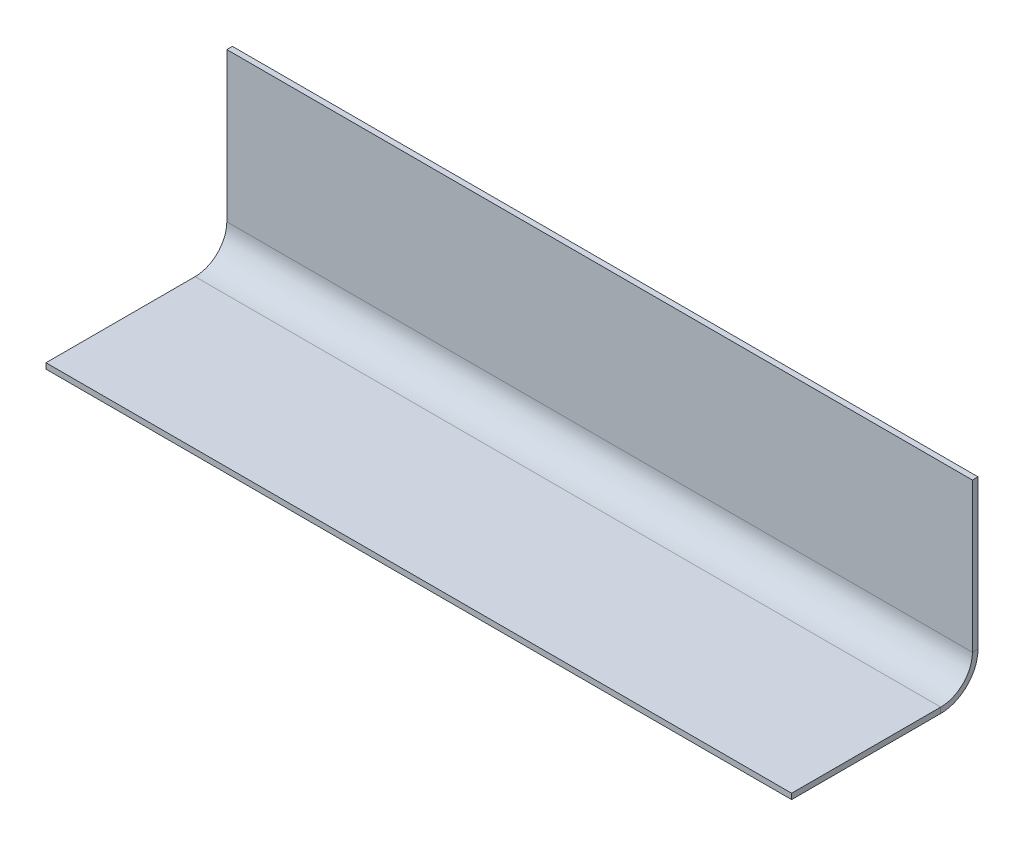
ISO-10303-21;
HEADER;
FILE_DESCRIPTION(('STEP AP214'),'2;1');
FILE_NAME('part.step','',(''),(''),'','','');
FILE_SCHEMA(('AUTOMOTIVE_DESIGN { 1 0 10303 214 1 1 1 1 }'));
ENDSEC;
DATA;
#1=APPLICATION_CONTEXT('core data for automotive mechanical design processes');
#2=APPLICATION_PROTOCOL_DEFINITION('international standard','automotive_design',2000,#1);
#3=PRODUCT_CONTEXT('',#1,'mechanical');
#4=PRODUCT('Part','Part','',(#3));
#5=PRODUCT_RELATED_PRODUCT_CATEGORY('part','',(#4));
#6=PRODUCT_DEFINITION_FORMATION('','',#4);
#7=PRODUCT_DEFINITION_CONTEXT('part definition',#1,'design');
#8=PRODUCT_DEFINITION('design','',#6,#7);
#9=PRODUCT_DEFINITION_SHAPE('','',#8);
#10=(LENGTH_UNIT() NAMED_UNIT(*) SI_UNIT(.MILLI.,.METRE.));
#11=(NAMED_UNIT(*) PLANE_ANGLE_UNIT() SI_UNIT($,.RADIAN.));
#12=(NAMED_UNIT(*) SI_UNIT($,.STERADIAN.) SOLID_ANGLE_UNIT());
#13=UNCERTAINTY_MEASURE_WITH_UNIT(LENGTH_MEASURE(1.E-05),#10,'distance_accuracy_value','');
#14=(GEOMETRIC_REPRESENTATION_CONTEXT(3) GLOBAL_UNCERTAINTY_ASSIGNED_CONTEXT((#13)) GLOBAL_UNIT_ASSIGNED_CONTEXT((#10,
#11,#12)) REPRESENTATION_CONTEXT('',''));
#15=CARTESIAN_POINT('',(0.,0.,0.));
#16=DIRECTION('',(0.,0.,1.));
#17=DIRECTION('',(1.,0.,0.));
#18=AXIS2_PLACEMENT_3D('',#15,#16,#17);
#19=CARTESIAN_POINT('',(200.,50.,-3.));
#20=DIRECTION('',(1.,0.,0.));
#21=DIRECTION('',(0.,0.,-1.));
#22=AXIS2_PLACEMENT_3D('',#19,#20,#21);
#23=PLANE('',#22);
#24=DIRECTION('',(0.,1.,0.));
#25=VECTOR('',#24,1.);
#26=CARTESIAN_POINT('',(200.,50.,0.));
#27=LINE('',#26,#25);
#28=CARTESIAN_POINT('',(200.,-30.0000000000001,0.));
#29=VERTEX_POINT('',#28);
#30=CARTESIAN_POINT('',(200.,50.,0.));
#31=VERTEX_POINT('',#30);
#32=EDGE_CURVE('E107',#29,#31,#27,.T.);
#33=ORIENTED_EDGE('',*,*,#32,.F.);
#34=DIRECTION('',(0.,0.,-1.));
#35=VECTOR('',#34,1.);
#36=CARTESIAN_POINT('',(200.,-30.0000000000001,0.));
#37=LINE('',#36,#35);
#38=CARTESIAN_POINT('',(200.,-30.0000000000001,-3.));
#39=VERTEX_POINT('',#38);
#40=EDGE_CURVE('E116',#29,#39,#37,.T.);
#41=ORIENTED_EDGE('',*,*,#40,.T.);
#42=DIRECTION('',(0.,1.,0.));
#43=VECTOR('',#42,1.);
#44=CARTESIAN_POINT('',(200.,50.,-3.));
#45=LINE('',#44,#43);
#46=CARTESIAN_POINT('',(200.,50.,-3.));
#47=VERTEX_POINT('',#46);
#48=EDGE_CURVE('E104',#39,#47,#45,.T.);
#49=ORIENTED_EDGE('',*,*,#48,.T.);
#50=DIRECTION('',(0.,0.,1.));
#51=VECTOR('',#50,1.);
#52=CARTESIAN_POINT('',(200.,50.,-3.));
#53=LINE('',#52,#51);
#54=EDGE_CURVE('E62',#47,#31,#53,.T.);
#55=ORIENTED_EDGE('',*,*,#54,.T.);
#56=EDGE_LOOP('',(#33,#41,#49,#55));
#57=FACE_BOUND('',#56,.T.);
#58=ADVANCED_FACE('F59',(#57),#23,.T.);
#59=CARTESIAN_POINT('',(0.,0.,-3.));
#60=DIRECTION('',(0.,0.,1.));
#61=DIRECTION('',(1.,0.,0.));
#62=AXIS2_PLACEMENT_3D('',#59,#60,#61);
#63=PLANE('',#62);
#64=DIRECTION('',(1.,0.,0.));
#65=VECTOR('',#64,1.);
#66=CARTESIAN_POINT('',(200.,-30.0000000000001,-3.));
#67=LINE('',#66,#65);
#68=CARTESIAN_POINT('',(-200.,-30.,-3.));
#69=VERTEX_POINT('',#68);
#70=EDGE_CURVE('E132',#39,#69,#67,.F.);
#71=ORIENTED_EDGE('',*,*,#70,.T.);
#72=DIRECTION('',(0.,-1.,0.));
#73=VECTOR('',#72,1.);
#74=CARTESIAN_POINT('',(-200.,50.,-3.));
#75=LINE('',#74,#73);
#76=CARTESIAN_POINT('',(-200.,50.,-3.));
#77=VERTEX_POINT('',#76);
#78=EDGE_CURVE('E112',#77,#69,#75,.T.);
#79=ORIENTED_EDGE('',*,*,#78,.F.);
#80=DIRECTION('',(-1.,0.,0.));
#81=VECTOR('',#80,1.);
#82=CARTESIAN_POINT('',(-200.,50.,-3.));
#83=LINE('',#82,#81);
#84=EDGE_CURVE('E97',#47,#77,#83,.T.);
#85=ORIENTED_EDGE('',*,*,#84,.F.);
#86=ORIENTED_EDGE('',*,*,#48,.F.);
#87=EDGE_LOOP('',(#71,#79,#85,#86));
#88=FACE_BOUND('',#87,.T.);
#89=ADVANCED_FACE('F223',(#88),#63,.F.);
#90=CARTESIAN_POINT('',(0.,0.,0.));
#91=DIRECTION('',(0.,0.,1.));
#92=DIRECTION('',(1.,0.,0.));
#93=AXIS2_PLACEMENT_3D('',#90,#91,#92);
#94=PLANE('',#93);
#95=DIRECTION('',(0.,-1.,0.));
#96=VECTOR('',#95,1.);
#97=CARTESIAN_POINT('',(-200.,50.,0.));
#98=LINE('',#97,#96);
#99=CARTESIAN_POINT('',(-200.,50.,0.));
#100=VERTEX_POINT('',#99);
#101=CARTESIAN_POINT('',(-200.,-30.0000000000001,0.));
#102=VERTEX_POINT('',#101);
#103=EDGE_CURVE('E99',#100,#102,#98,.T.);
#104=ORIENTED_EDGE('',*,*,#103,.T.);
#105=DIRECTION('',(1.,0.,0.));
#106=VECTOR('',#105,1.);
#107=CARTESIAN_POINT('',(200.,-30.0000000000001,0.));
#108=LINE('',#107,#106);
#109=EDGE_CURVE('E73',#29,#102,#108,.F.);
#110=ORIENTED_EDGE('',*,*,#109,.F.);
#111=ORIENTED_EDGE('',*,*,#32,.T.);
#112=DIRECTION('',(-1.,0.,0.));
#113=VECTOR('',#112,1.);
#114=CARTESIAN_POINT('',(-200.,50.,0.));
#115=LINE('',#114,#113);
#116=EDGE_CURVE('E95',#31,#100,#115,.T.);
#117=ORIENTED_EDGE('',*,*,#116,.T.);
#118=EDGE_LOOP('',(#104,#110,#111,#117));
#119=FACE_BOUND('',#118,.T.);
#120=ADVANCED_FACE('F106',(#119),#94,.T.);
#121=CARTESIAN_POINT('',(-200.,50.,-3.));
#122=DIRECTION('',(-1.,0.,0.));
#123=DIRECTION('',(0.,0.,1.));
#124=AXIS2_PLACEMENT_3D('',#121,#122,#123);
#125=PLANE('',#124);
#126=DIRECTION('',(0.,0.,-1.));
#127=VECTOR('',#126,1.);
#128=CARTESIAN_POINT('',(-200.,-30.0000000000001,0.));
#129=LINE('',#128,#127);
#130=EDGE_CURVE('E103',#102,#69,#129,.T.);
#131=ORIENTED_EDGE('',*,*,#130,.F.);
#132=ORIENTED_EDGE('',*,*,#103,.F.);
#133=DIRECTION('',(0.,0.,1.));
#134=VECTOR('',#133,1.);
#135=CARTESIAN_POINT('',(-200.,50.,-3.));
#136=LINE('',#135,#134);
#137=EDGE_CURVE('E13',#77,#100,#136,.T.);
#138=ORIENTED_EDGE('',*,*,#137,.F.);
#139=ORIENTED_EDGE('',*,*,#78,.T.);
#140=EDGE_LOOP('',(#131,#132,#138,#139));
#141=FACE_BOUND('',#140,.T.);
#142=ADVANCED_FACE('F100',(#141),#125,.T.);
#143=CARTESIAN_POINT('',(-200.,50.,-3.));
#144=DIRECTION('',(0.,1.,0.));
#145=DIRECTION('',(0.,0.,1.));
#146=AXIS2_PLACEMENT_3D('',#143,#144,#145);
#147=PLANE('',#146);
#148=ORIENTED_EDGE('',*,*,#116,.F.);
#149=ORIENTED_EDGE('',*,*,#54,.F.);
#150=ORIENTED_EDGE('',*,*,#84,.T.);
#151=ORIENTED_EDGE('',*,*,#137,.T.);
#152=EDGE_LOOP('',(#148,#149,#150,#151));
#153=FACE_BOUND('',#152,.T.);
#154=ADVANCED_FACE('F92',(#153),#147,.T.);
#155=CARTESIAN_POINT('',(-200.,-30.0000000000001,17.));
#156=DIRECTION('',(-1.,0.,0.));
#157=DIRECTION('',(0.,0.,1.));
#158=AXIS2_PLACEMENT_3D('',#155,#156,#157);
#159=PLANE('',#158);
#160=DIRECTION('',(0.,-1.,0.));
#161=VECTOR('',#160,1.);
#162=CARTESIAN_POINT('',(-200.,-50.0000000000001,16.9999999999999));
#163=LINE('',#162,#161);
#164=CARTESIAN_POINT('',(-200.,-47.0000000000001,16.9999999999999));
#165=VERTEX_POINT('',#164);
#166=CARTESIAN_POINT('',(-200.,-50.0000000000001,16.9999999999999));
#167=VERTEX_POINT('',#166);
#168=EDGE_CURVE('E137',#165,#167,#163,.T.);
#169=ORIENTED_EDGE('',*,*,#168,.F.);
#170=CARTESIAN_POINT('',(-200.,-30.0000000000001,17.));
#171=DIRECTION('',(1.,0.,0.));
#172=DIRECTION('',(0.,0.,-1.));
#173=AXIS2_PLACEMENT_3D('',#170,#171,#172);
#174=CIRCLE('',#173,17.);
#175=EDGE_CURVE('E126',#102,#165,#174,.F.);
#176=ORIENTED_EDGE('',*,*,#175,.F.);
#177=ORIENTED_EDGE('',*,*,#130,.T.);
#178=CARTESIAN_POINT('',(-200.,-30.0000000000001,17.));
#179=DIRECTION('',(1.,0.,0.));
#180=DIRECTION('',(0.,0.,-1.));
#181=AXIS2_PLACEMENT_3D('',#178,#179,#180);
#182=CIRCLE('',#181,20.);
#183=EDGE_CURVE('E119',#69,#167,#182,.F.);
#184=ORIENTED_EDGE('',*,*,#183,.T.);
#185=EDGE_LOOP('',(#169,#176,#177,#184));
#186=FACE_BOUND('',#185,.T.);
#187=ADVANCED_FACE('F214',(#186),#159,.T.);
#188=CARTESIAN_POINT('',(200.,-30.0000000000001,17.));
#189=DIRECTION('',(-1.,0.,0.));
#190=DIRECTION('',(0.,0.,1.));
#191=AXIS2_PLACEMENT_3D('',#188,#189,#190);
#192=PLANE('',#191);
#193=CARTESIAN_POINT('',(200.,-30.0000000000001,17.));
#194=DIRECTION('',(1.,0.,0.));
#195=DIRECTION('',(0.,0.,-1.));
#196=AXIS2_PLACEMENT_3D('',#193,#194,#195);
#197=CIRCLE('',#196,17.);
#198=CARTESIAN_POINT('',(200.,-47.0000000000001,16.9999999999999));
#199=VERTEX_POINT('',#198);
#200=EDGE_CURVE('E121',#199,#29,#197,.T.);
#201=ORIENTED_EDGE('',*,*,#200,.F.);
#202=DIRECTION('',(0.,-1.,0.));
#203=VECTOR('',#202,1.);
#204=CARTESIAN_POINT('',(200.,-47.0000000000001,16.9999999999999));
#205=LINE('',#204,#203);
#206=CARTESIAN_POINT('',(200.,-50.0000000000001,16.9999999999999));
#207=VERTEX_POINT('',#206);
#208=EDGE_CURVE('E143',#199,#207,#205,.T.);
#209=ORIENTED_EDGE('',*,*,#208,.T.);
#210=CARTESIAN_POINT('',(200.,-30.0000000000001,17.));
#211=DIRECTION('',(1.,0.,0.));
#212=DIRECTION('',(0.,0.,-1.));
#213=AXIS2_PLACEMENT_3D('',#210,#211,#212);
#214=CIRCLE('',#213,20.);
#215=EDGE_CURVE('E129',#207,#39,#214,.T.);
#216=ORIENTED_EDGE('',*,*,#215,.T.);
#217=ORIENTED_EDGE('',*,*,#40,.F.);
#218=EDGE_LOOP('',(#201,#209,#216,#217));
#219=FACE_BOUND('',#218,.T.);
#220=ADVANCED_FACE('F198',(#219),#192,.F.);
#221=CARTESIAN_POINT('',(200.,-30.0000000000001,17.));
#222=DIRECTION('',(1.,0.,0.));
#223=DIRECTION('',(0.,-1.,0.));
#224=AXIS2_PLACEMENT_3D('',#221,#222,#223);
#225=CYLINDRICAL_SURFACE('',#224,20.);
#226=ORIENTED_EDGE('',*,*,#70,.F.);
#227=ORIENTED_EDGE('',*,*,#215,.F.);
#228=DIRECTION('',(1.,0.,0.));
#229=VECTOR('',#228,1.);
#230=CARTESIAN_POINT('',(0.,-50.0000000000001,16.9999999999999));
#231=LINE('',#230,#229);
#232=EDGE_CURVE('E146',#167,#207,#231,.T.);
#233=ORIENTED_EDGE('',*,*,#232,.F.);
#234=ORIENTED_EDGE('',*,*,#183,.F.);
#235=EDGE_LOOP('',(#226,#227,#233,#234));
#236=FACE_BOUND('',#235,.T.);
#237=ADVANCED_FACE('F210',(#236),#225,.T.);
#238=CARTESIAN_POINT('',(200.,-30.0000000000001,17.));
#239=DIRECTION('',(1.,0.,0.));
#240=DIRECTION('',(0.,-1.,0.));
#241=AXIS2_PLACEMENT_3D('',#238,#239,#240);
#242=CYLINDRICAL_SURFACE('',#241,17.);
#243=ORIENTED_EDGE('',*,*,#109,.T.);
#244=ORIENTED_EDGE('',*,*,#175,.T.);
#245=DIRECTION('',(-1.,0.,0.));
#246=VECTOR('',#245,1.);
#247=CARTESIAN_POINT('',(-200.,-47.0000000000001,16.9999999999999));
#248=LINE('',#247,#246);
#249=EDGE_CURVE('E140',#165,#199,#248,.F.);
#250=ORIENTED_EDGE('',*,*,#249,.T.);
#251=ORIENTED_EDGE('',*,*,#200,.T.);
#252=EDGE_LOOP('',(#243,#244,#250,#251));
#253=FACE_BOUND('',#252,.T.);
#254=ADVANCED_FACE('F226',(#253),#242,.F.);
#255=CARTESIAN_POINT('',(200.,-50.,0.));
#256=DIRECTION('',(1.,0.,0.));
#257=DIRECTION('',(0.,0.,-1.));
#258=AXIS2_PLACEMENT_3D('',#255,#256,#257);
#259=PLANE('',#258);
#260=DIRECTION('',(0.,0.,-1.));
#261=VECTOR('',#260,1.);
#262=CARTESIAN_POINT('',(200.,-50.,0.));
#263=LINE('',#262,#261);
#264=CARTESIAN_POINT('',(200.,-50.0000000000003,96.9999999999996));
#265=VERTEX_POINT('',#264);
#266=EDGE_CURVE('E164',#265,#207,#263,.T.);
#267=ORIENTED_EDGE('',*,*,#266,.T.);
#268=ORIENTED_EDGE('',*,*,#208,.F.);
#269=DIRECTION('',(0.,0.,1.));
#270=VECTOR('',#269,1.);
#271=CARTESIAN_POINT('',(200.,-47.,-1.75260722315183E-13));
#272=LINE('',#271,#270);
#273=CARTESIAN_POINT('',(200.,-47.0000000000003,96.9999999999997));
#274=VERTEX_POINT('',#273);
#275=EDGE_CURVE('E155',#274,#199,#272,.F.);
#276=ORIENTED_EDGE('',*,*,#275,.F.);
#277=DIRECTION('',(0.,1.,0.));
#278=VECTOR('',#277,1.);
#279=CARTESIAN_POINT('',(200.,-50.0000000000003,96.9999999999996));
#280=LINE('',#279,#278);
#281=EDGE_CURVE('E124',#265,#274,#280,.T.);
#282=ORIENTED_EDGE('',*,*,#281,.F.);
#283=EDGE_LOOP('',(#267,#268,#276,#282));
#284=FACE_BOUND('',#283,.T.);
#285=ADVANCED_FACE('F191',(#284),#259,.T.);
#286=CARTESIAN_POINT('',(-200.,-50.0000000000003,96.9999999999996));
#287=DIRECTION('',(-1.,0.,0.));
#288=DIRECTION('',(0.,0.,1.));
#289=AXIS2_PLACEMENT_3D('',#286,#287,#288);
#290=PLANE('',#289);
#291=DIRECTION('',(0.,0.,-1.));
#292=VECTOR('',#291,1.);
#293=CARTESIAN_POINT('',(-200.,-47.,-1.75260722315183E-13));
#294=LINE('',#293,#292);
#295=CARTESIAN_POINT('',(-200.,-47.0000000000003,96.9999999999997));
#296=VERTEX_POINT('',#295);
#297=EDGE_CURVE('E149',#165,#296,#294,.F.);
#298=ORIENTED_EDGE('',*,*,#297,.F.);
#299=ORIENTED_EDGE('',*,*,#168,.T.);
#300=DIRECTION('',(0.,0.,1.));
#301=VECTOR('',#300,1.);
#302=CARTESIAN_POINT('',(-200.,-50.0000000000003,96.9999999999996));
#303=LINE('',#302,#301);
#304=CARTESIAN_POINT('',(-200.,-50.0000000000003,96.9999999999996));
#305=VERTEX_POINT('',#304);
#306=EDGE_CURVE('E158',#167,#305,#303,.T.);
#307=ORIENTED_EDGE('',*,*,#306,.T.);
#308=DIRECTION('',(0.,1.,0.));
#309=VECTOR('',#308,1.);
#310=CARTESIAN_POINT('',(-200.,-50.0000000000003,96.9999999999996));
#311=LINE('',#310,#309);
#312=EDGE_CURVE('E167',#305,#296,#311,.T.);
#313=ORIENTED_EDGE('',*,*,#312,.T.);
#314=EDGE_LOOP('',(#298,#299,#307,#313));
#315=FACE_BOUND('',#314,.T.);
#316=ADVANCED_FACE('F217',(#315),#290,.T.);
#317=CARTESIAN_POINT('',(0.,-50.,-1.85735166331713E-13));
#318=DIRECTION('',(0.,-1.,0.));
#319=DIRECTION('',(0.,0.,-1.));
#320=AXIS2_PLACEMENT_3D('',#317,#318,#319);
#321=PLANE('',#320);
#322=ORIENTED_EDGE('',*,*,#306,.F.);
#323=ORIENTED_EDGE('',*,*,#232,.T.);
#324=ORIENTED_EDGE('',*,*,#266,.F.);
#325=DIRECTION('',(1.,0.,0.));
#326=VECTOR('',#325,1.);
#327=CARTESIAN_POINT('',(200.,-50.0000000000003,96.9999999999996));
#328=LINE('',#327,#326);
#329=EDGE_CURVE('E161',#305,#265,#328,.T.);
#330=ORIENTED_EDGE('',*,*,#329,.F.);
#331=EDGE_LOOP('',(#322,#323,#324,#330));
#332=FACE_BOUND('',#331,.T.);
#333=ADVANCED_FACE('F206',(#332),#321,.T.);
#334=CARTESIAN_POINT('',(0.,-47.,-1.75260722315183E-13));
#335=DIRECTION('',(0.,-1.,0.));
#336=DIRECTION('',(0.,0.,-1.));
#337=AXIS2_PLACEMENT_3D('',#334,#335,#336);
#338=PLANE('',#337);
#339=ORIENTED_EDGE('',*,*,#249,.F.);
#340=ORIENTED_EDGE('',*,*,#297,.T.);
#341=DIRECTION('',(-1.,0.,0.));
#342=VECTOR('',#341,1.);
#343=CARTESIAN_POINT('',(0.,-47.0000000000003,96.9999999999997));
#344=LINE('',#343,#342);
#345=EDGE_CURVE('E152',#296,#274,#344,.F.);
#346=ORIENTED_EDGE('',*,*,#345,.T.);
#347=ORIENTED_EDGE('',*,*,#275,.T.);
#348=EDGE_LOOP('',(#339,#340,#346,#347));
#349=FACE_BOUND('',#348,.T.);
#350=ADVANCED_FACE('F187',(#349),#338,.F.);
#351=CARTESIAN_POINT('',(200.,-50.0000000000003,96.9999999999996));
#352=DIRECTION('',(0.,0.,1.));
#353=DIRECTION('',(0.,-1.,0.));
#354=AXIS2_PLACEMENT_3D('',#351,#352,#353);
#355=PLANE('',#354);
#356=ORIENTED_EDGE('',*,*,#345,.F.);
#357=ORIENTED_EDGE('',*,*,#312,.F.);
#358=ORIENTED_EDGE('',*,*,#329,.T.);
#359=ORIENTED_EDGE('',*,*,#281,.T.);
#360=EDGE_LOOP('',(#356,#357,#358,#359));
#361=FACE_BOUND('',#360,.T.);
#362=ADVANCED_FACE('F175',(#361),#355,.T.);
#363=CLOSED_SHELL('',(#58,#89,#120,#142,#154,#187,#220,#237,#254,#285,#316,#333,#350,#362));
#364=MANIFOLD_SOLID_BREP('B2',#363);
#365=ADVANCED_BREP_SHAPE_REPRESENTATION('',(#18,#364),#14);
#366=SHAPE_DEFINITION_REPRESENTATION(#9,#365);
ENDSEC;
END-ISO-10303-21;
